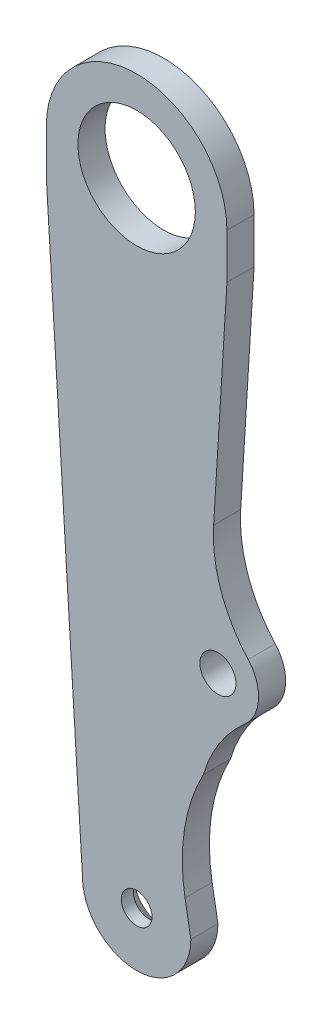
ISO-10303-21;
HEADER;
FILE_DESCRIPTION(('STEP AP214'),'2;1');
FILE_NAME('part.step','',(''),(''),'','','');
FILE_SCHEMA(('AUTOMOTIVE_DESIGN { 1 0 10303 214 1 1 1 1 }'));
ENDSEC;
DATA;
#1=APPLICATION_CONTEXT('core data for automotive mechanical design processes');
#2=APPLICATION_PROTOCOL_DEFINITION('international standard','automotive_design',2000,#1);
#3=PRODUCT_CONTEXT('',#1,'mechanical');
#4=PRODUCT('Part','Part','',(#3));
#5=PRODUCT_RELATED_PRODUCT_CATEGORY('part','',(#4));
#6=PRODUCT_DEFINITION_FORMATION('','',#4);
#7=PRODUCT_DEFINITION_CONTEXT('part definition',#1,'design');
#8=PRODUCT_DEFINITION('design','',#6,#7);
#9=PRODUCT_DEFINITION_SHAPE('','',#8);
#10=(LENGTH_UNIT() NAMED_UNIT(*) SI_UNIT(.MILLI.,.METRE.));
#11=(NAMED_UNIT(*) PLANE_ANGLE_UNIT() SI_UNIT($,.RADIAN.));
#12=(NAMED_UNIT(*) SI_UNIT($,.STERADIAN.) SOLID_ANGLE_UNIT());
#13=UNCERTAINTY_MEASURE_WITH_UNIT(LENGTH_MEASURE(1.E-05),#10,'distance_accuracy_value','');
#14=(GEOMETRIC_REPRESENTATION_CONTEXT(3) GLOBAL_UNCERTAINTY_ASSIGNED_CONTEXT((#13)) GLOBAL_UNIT_ASSIGNED_CONTEXT((#10,
#11,#12)) REPRESENTATION_CONTEXT('',''));
#15=CARTESIAN_POINT('',(0.,0.,0.));
#16=DIRECTION('',(0.,0.,1.));
#17=DIRECTION('',(1.,0.,0.));
#18=AXIS2_PLACEMENT_3D('',#15,#16,#17);
#19=CARTESIAN_POINT('',(0.,0.,0.));
#20=DIRECTION('',(0.,0.,1.));
#21=DIRECTION('',(1.,0.,0.));
#22=AXIS2_PLACEMENT_3D('',#19,#20,#21);
#23=PLANE('',#22);
#24=CARTESIAN_POINT('',(21.7837604708258,-22.7249946765542,0.));
#25=DIRECTION('',(0.,0.,1.));
#26=DIRECTION('',(1.,0.,0.));
#27=AXIS2_PLACEMENT_3D('',#24,#25,#26);
#28=CIRCLE('',#27,15.);
#29=CARTESIAN_POINT('',(11.9500985701906,-11.3980756945894,0.));
#30=VERTEX_POINT('',#29);
#31=CARTESIAN_POINT('',(7.3910741342489,-18.5,0.));
#32=VERTEX_POINT('',#31);
#33=EDGE_CURVE('E236',#30,#32,#28,.T.);
#34=ORIENTED_EDGE('',*,*,#33,.T.);
#35=CARTESIAN_POINT('',(25.0535709837935,-27.882761056311,0.));
#36=DIRECTION('',(0.,0.,1.));
#37=DIRECTION('',(1.,0.,0.));
#38=AXIS2_PLACEMENT_3D('',#35,#36,#37);
#39=CIRCLE('',#38,20.);
#40=CARTESIAN_POINT('',(5.35741592354935,-31.3557246096497,0.));
#41=VERTEX_POINT('',#40);
#42=EDGE_CURVE('E12',#32,#41,#39,.T.);
#43=ORIENTED_EDGE('',*,*,#42,.T.);
#44=DIRECTION('',(-0.173648177666935,0.984807753012207,0.));
#45=VECTOR('',#44,1.);
#46=CARTESIAN_POINT('',(-0.166274645841638,-0.0293187062696261,0.));
#47=LINE('',#46,#45);
#48=CARTESIAN_POINT('',(6.,-35.,0.));
#49=VERTEX_POINT('',#48);
#50=EDGE_CURVE('E127',#49,#41,#47,.T.);
#51=ORIENTED_EDGE('',*,*,#50,.F.);
#52=CARTESIAN_POINT('',(0.,-35.,0.));
#53=DIRECTION('',(0.,0.,-1.));
#54=DIRECTION('',(-1.,0.,0.));
#55=AXIS2_PLACEMENT_3D('',#52,#53,#54);
#56=CIRCLE('',#55,6.);
#57=CARTESIAN_POINT('',(-6.,-35.,0.));
#58=VERTEX_POINT('',#57);
#59=EDGE_CURVE('E141',#49,#58,#56,.T.);
#60=ORIENTED_EDGE('',*,*,#59,.T.);
#61=DIRECTION('',(0.06142226891833,-0.998111869922868,0.));
#62=VECTOR('',#61,1.);
#63=CARTESIAN_POINT('',(-8.12308417825983,-0.499882103277526,0.));
#64=LINE('',#63,#62);
#65=CARTESIAN_POINT('',(-9.99999999999999,30.0000000000002,0.));
#66=VERTEX_POINT('',#65);
#67=EDGE_CURVE('E135',#66,#58,#64,.T.);
#68=ORIENTED_EDGE('',*,*,#67,.F.);
#69=DIRECTION('',(0.,-1.,0.));
#70=VECTOR('',#69,1.);
#71=CARTESIAN_POINT('',(-9.99999999999999,0.,0.));
#72=LINE('',#71,#70);
#73=CARTESIAN_POINT('',(-9.99999999999999,35.,0.));
#74=VERTEX_POINT('',#73);
#75=EDGE_CURVE('E206',#74,#66,#72,.T.);
#76=ORIENTED_EDGE('',*,*,#75,.F.);
#77=CARTESIAN_POINT('',(0.,35.,0.));
#78=DIRECTION('',(0.,0.,1.));
#79=DIRECTION('',(1.,0.,0.));
#80=AXIS2_PLACEMENT_3D('',#77,#78,#79);
#81=CIRCLE('',#80,9.99999999999999);
#82=CARTESIAN_POINT('',(9.99999999999999,35.,0.));
#83=VERTEX_POINT('',#82);
#84=EDGE_CURVE('E185',#83,#74,#81,.T.);
#85=ORIENTED_EDGE('',*,*,#84,.F.);
#86=DIRECTION('',(0.,-1.,0.));
#87=VECTOR('',#86,1.);
#88=CARTESIAN_POINT('',(9.99999999999999,0.,0.));
#89=LINE('',#88,#87);
#90=CARTESIAN_POINT('',(9.99999999999999,30.0000000000002,0.));
#91=VERTEX_POINT('',#90);
#92=EDGE_CURVE('E194',#83,#91,#89,.T.);
#93=ORIENTED_EDGE('',*,*,#92,.T.);
#94=DIRECTION('',(-0.06142226891833,-0.998111869922868,0.));
#95=VECTOR('',#94,1.);
#96=CARTESIAN_POINT('',(8.12308417825983,-0.499882103277526,0.));
#97=LINE('',#96,#95);
#98=CARTESIAN_POINT('',(8.52109371572055,5.96777288045908,0.));
#99=VERTEX_POINT('',#98);
#100=EDGE_CURVE('E154',#91,#99,#97,.T.);
#101=ORIENTED_EDGE('',*,*,#100,.T.);
#102=CARTESIAN_POINT('',(23.4927717645636,5.04643884668413,0.));
#103=DIRECTION('',(0.,0.,1.));
#104=DIRECTION('',(1.,0.,0.));
#105=AXIS2_PLACEMENT_3D('',#102,#103,#104);
#106=CIRCLE('',#105,15.);
#107=CARTESIAN_POINT('',(12.3444857918224,-4.9892833430729,0.));
#108=VERTEX_POINT('',#107);
#109=EDGE_CURVE('E233',#99,#108,#106,.T.);
#110=ORIENTED_EDGE('',*,*,#109,.T.);
#111=CARTESIAN_POINT('',(8.99999999999999,-8.,0.));
#112=DIRECTION('',(0.,0.,-1.));
#113=DIRECTION('',(-1.,0.,0.));
#114=AXIS2_PLACEMENT_3D('',#111,#112,#113);
#115=CIRCLE('',#114,4.5);
#116=EDGE_CURVE('E157',#108,#30,#115,.T.);
#117=ORIENTED_EDGE('',*,*,#116,.T.);
#118=EDGE_LOOP('',(#34,#43,#51,#60,#68,#76,#85,#93,#101,#110,#117));
#119=FACE_BOUND('',#118,.T.);
#120=CARTESIAN_POINT('',(8.99999999999999,-8.,0.));
#121=DIRECTION('',(0.,0.,1.));
#122=DIRECTION('',(1.,0.,0.));
#123=AXIS2_PLACEMENT_3D('',#120,#121,#122);
#124=CIRCLE('',#123,2.);
#125=CARTESIAN_POINT('',(11.,-8.,0.));
#126=VERTEX_POINT('',#125);
#127=EDGE_CURVE('E257',#126,#126,#124,.T.);
#128=ORIENTED_EDGE('',*,*,#127,.T.);
#129=EDGE_LOOP('',(#128));
#130=FACE_BOUND('',#129,.T.);
#131=CARTESIAN_POINT('',(0.,35.,0.));
#132=DIRECTION('',(0.,0.,1.));
#133=DIRECTION('',(1.,0.,0.));
#134=AXIS2_PLACEMENT_3D('',#131,#132,#133);
#135=CIRCLE('',#134,6.5);
#136=CARTESIAN_POINT('',(6.5,35.,0.));
#137=VERTEX_POINT('',#136);
#138=EDGE_CURVE('E181',#137,#137,#135,.T.);
#139=ORIENTED_EDGE('',*,*,#138,.T.);
#140=EDGE_LOOP('',(#139));
#141=FACE_BOUND('',#140,.T.);
#142=CARTESIAN_POINT('',(0.,-35.,0.));
#143=DIRECTION('',(0.,0.,-1.));
#144=DIRECTION('',(-1.,0.,0.));
#145=AXIS2_PLACEMENT_3D('',#142,#143,#144);
#146=CIRCLE('',#145,3.36);
#147=CARTESIAN_POINT('',(-3.36,-35.,0.));
#148=VERTEX_POINT('',#147);
#149=EDGE_CURVE('E451',#148,#148,#146,.T.);
#150=ORIENTED_EDGE('',*,*,#149,.F.);
#151=EDGE_LOOP('',(#150));
#152=FACE_BOUND('',#151,.T.);
#153=ADVANCED_FACE('F42',(#119,#130,#141,#152),#23,.F.);
#154=CARTESIAN_POINT('',(0.,0.,3.));
#155=DIRECTION('',(0.,0.,1.));
#156=DIRECTION('',(1.,0.,0.));
#157=AXIS2_PLACEMENT_3D('',#154,#155,#156);
#158=PLANE('',#157);
#159=CARTESIAN_POINT('',(0.,-35.,3.));
#160=DIRECTION('',(0.,0.,-1.));
#161=DIRECTION('',(-1.,0.,0.));
#162=AXIS2_PLACEMENT_3D('',#159,#160,#161);
#163=CIRCLE('',#162,1.69999999999999);
#164=CARTESIAN_POINT('',(-1.69999999999999,-35.,3.));
#165=VERTEX_POINT('',#164);
#166=EDGE_CURVE('E456',#165,#165,#163,.T.);
#167=ORIENTED_EDGE('',*,*,#166,.T.);
#168=EDGE_LOOP('',(#167));
#169=FACE_BOUND('',#168,.T.);
#170=CARTESIAN_POINT('',(8.99999999999999,-8.,3.));
#171=DIRECTION('',(0.,0.,1.));
#172=DIRECTION('',(1.,0.,0.));
#173=AXIS2_PLACEMENT_3D('',#170,#171,#172);
#174=CIRCLE('',#173,2.);
#175=CARTESIAN_POINT('',(11.,-8.,3.));
#176=VERTEX_POINT('',#175);
#177=EDGE_CURVE('E253',#176,#176,#174,.T.);
#178=ORIENTED_EDGE('',*,*,#177,.F.);
#179=EDGE_LOOP('',(#178));
#180=FACE_BOUND('',#179,.T.);
#181=CARTESIAN_POINT('',(0.,35.,3.));
#182=DIRECTION('',(0.,0.,1.));
#183=DIRECTION('',(1.,0.,0.));
#184=AXIS2_PLACEMENT_3D('',#181,#182,#183);
#185=CIRCLE('',#184,6.5);
#186=CARTESIAN_POINT('',(6.5,35.,3.));
#187=VERTEX_POINT('',#186);
#188=EDGE_CURVE('E180',#187,#187,#185,.T.);
#189=ORIENTED_EDGE('',*,*,#188,.F.);
#190=EDGE_LOOP('',(#189));
#191=FACE_BOUND('',#190,.T.);
#192=DIRECTION('',(-0.173648177666935,0.984807753012207,0.));
#193=VECTOR('',#192,1.);
#194=CARTESIAN_POINT('',(-0.166274645841638,-0.0293187062696261,3.));
#195=LINE('',#194,#193);
#196=CARTESIAN_POINT('',(6.,-35.,3.));
#197=VERTEX_POINT('',#196);
#198=CARTESIAN_POINT('',(5.35741592354935,-31.3557246096497,3.));
#199=VERTEX_POINT('',#198);
#200=EDGE_CURVE('E129',#197,#199,#195,.T.);
#201=ORIENTED_EDGE('',*,*,#200,.T.);
#202=CARTESIAN_POINT('',(25.0535709837935,-27.882761056311,3.));
#203=DIRECTION('',(0.,0.,1.));
#204=DIRECTION('',(1.,0.,0.));
#205=AXIS2_PLACEMENT_3D('',#202,#203,#204);
#206=CIRCLE('',#205,20.);
#207=CARTESIAN_POINT('',(7.3910741342489,-18.5,3.));
#208=VERTEX_POINT('',#207);
#209=EDGE_CURVE('E51',#199,#208,#206,.F.);
#210=ORIENTED_EDGE('',*,*,#209,.T.);
#211=CARTESIAN_POINT('',(21.7837604708258,-22.7249946765542,3.));
#212=DIRECTION('',(0.,0.,1.));
#213=DIRECTION('',(1.,0.,0.));
#214=AXIS2_PLACEMENT_3D('',#211,#212,#213);
#215=CIRCLE('',#214,15.);
#216=CARTESIAN_POINT('',(11.9500985701906,-11.3980756945894,3.));
#217=VERTEX_POINT('',#216);
#218=EDGE_CURVE('E239',#208,#217,#215,.F.);
#219=ORIENTED_EDGE('',*,*,#218,.T.);
#220=CARTESIAN_POINT('',(8.99999999999999,-8.,3.));
#221=DIRECTION('',(0.,0.,1.));
#222=DIRECTION('',(1.,0.,0.));
#223=AXIS2_PLACEMENT_3D('',#220,#221,#222);
#224=CIRCLE('',#223,4.5);
#225=CARTESIAN_POINT('',(12.3444857918224,-4.9892833430729,3.));
#226=VERTEX_POINT('',#225);
#227=EDGE_CURVE('E150',#226,#217,#224,.F.);
#228=ORIENTED_EDGE('',*,*,#227,.F.);
#229=CARTESIAN_POINT('',(23.4927717645636,5.04643884668413,3.));
#230=DIRECTION('',(0.,0.,1.));
#231=DIRECTION('',(1.,0.,0.));
#232=AXIS2_PLACEMENT_3D('',#229,#230,#231);
#233=CIRCLE('',#232,15.);
#234=CARTESIAN_POINT('',(8.52109371572055,5.96777288045908,3.));
#235=VERTEX_POINT('',#234);
#236=EDGE_CURVE('E230',#226,#235,#233,.F.);
#237=ORIENTED_EDGE('',*,*,#236,.T.);
#238=DIRECTION('',(0.06142226891833,0.998111869922868,0.));
#239=VECTOR('',#238,1.);
#240=CARTESIAN_POINT('',(8.12308417825983,-0.499882103277526,3.));
#241=LINE('',#240,#239);
#242=CARTESIAN_POINT('',(9.99999999999999,30.0000000000002,3.));
#243=VERTEX_POINT('',#242);
#244=EDGE_CURVE('E166',#235,#243,#241,.T.);
#245=ORIENTED_EDGE('',*,*,#244,.T.);
#246=DIRECTION('',(0.,-1.,0.));
#247=VECTOR('',#246,1.);
#248=CARTESIAN_POINT('',(9.99999999999999,0.,3.));
#249=LINE('',#248,#247);
#250=CARTESIAN_POINT('',(9.99999999999999,35.,3.));
#251=VERTEX_POINT('',#250);
#252=EDGE_CURVE('E198',#251,#243,#249,.T.);
#253=ORIENTED_EDGE('',*,*,#252,.F.);
#254=CARTESIAN_POINT('',(0.,35.,3.));
#255=DIRECTION('',(0.,0.,1.));
#256=DIRECTION('',(1.,0.,0.));
#257=AXIS2_PLACEMENT_3D('',#254,#255,#256);
#258=CIRCLE('',#257,9.99999999999999);
#259=CARTESIAN_POINT('',(-9.99999999999999,35.,3.));
#260=VERTEX_POINT('',#259);
#261=EDGE_CURVE('E189',#251,#260,#258,.T.);
#262=ORIENTED_EDGE('',*,*,#261,.T.);
#263=DIRECTION('',(0.,-1.,0.));
#264=VECTOR('',#263,1.);
#265=CARTESIAN_POINT('',(-9.99999999999999,0.,3.));
#266=LINE('',#265,#264);
#267=CARTESIAN_POINT('',(-9.99999999999999,30.,3.));
#268=VERTEX_POINT('',#267);
#269=EDGE_CURVE('E193',#260,#268,#266,.T.);
#270=ORIENTED_EDGE('',*,*,#269,.T.);
#271=DIRECTION('',(-0.06142226891833,0.998111869922868,0.));
#272=VECTOR('',#271,1.);
#273=CARTESIAN_POINT('',(-8.12308417825983,-0.499882103277526,3.));
#274=LINE('',#273,#272);
#275=CARTESIAN_POINT('',(-6.,-35.,3.));
#276=VERTEX_POINT('',#275);
#277=EDGE_CURVE('E177',#276,#268,#274,.T.);
#278=ORIENTED_EDGE('',*,*,#277,.F.);
#279=CARTESIAN_POINT('',(0.,-35.,3.));
#280=DIRECTION('',(0.,0.,1.));
#281=DIRECTION('',(1.,0.,0.));
#282=AXIS2_PLACEMENT_3D('',#279,#280,#281);
#283=CIRCLE('',#282,6.);
#284=EDGE_CURVE('E149',#197,#276,#283,.F.);
#285=ORIENTED_EDGE('',*,*,#284,.F.);
#286=EDGE_LOOP('',(#201,#210,#219,#228,#237,#245,#253,#262,#270,#278,#285));
#287=FACE_BOUND('',#286,.T.);
#288=ADVANCED_FACE('F247',(#169,#180,#191,#287),#158,.T.);
#289=CARTESIAN_POINT('',(21.7837604708258,-22.7249946765542,15.7279220613579));
#290=DIRECTION('',(0.,0.,-1.));
#291=DIRECTION('',(-1.,0.,0.));
#292=AXIS2_PLACEMENT_3D('',#289,#290,#291);
#293=CYLINDRICAL_SURFACE('',#292,15.);
#294=DIRECTION('',(0.,0.,1.));
#295=VECTOR('',#294,1.);
#296=CARTESIAN_POINT('',(7.3910741342489,-18.5,0.));
#297=LINE('',#296,#295);
#298=EDGE_CURVE('E143',#32,#208,#297,.T.);
#299=ORIENTED_EDGE('',*,*,#298,.F.);
#300=ORIENTED_EDGE('',*,*,#33,.F.);
#301=DIRECTION('',(0.,0.,-1.));
#302=VECTOR('',#301,1.);
#303=CARTESIAN_POINT('',(11.9500985701906,-11.3980756945894,15.7279220613579));
#304=LINE('',#303,#302);
#305=EDGE_CURVE('E219',#217,#30,#304,.T.);
#306=ORIENTED_EDGE('',*,*,#305,.F.);
#307=ORIENTED_EDGE('',*,*,#218,.F.);
#308=EDGE_LOOP('',(#299,#300,#306,#307));
#309=FACE_BOUND('',#308,.T.);
#310=ADVANCED_FACE('F251',(#309),#293,.F.);
#311=CARTESIAN_POINT('',(9.99999999999999,0.,3.));
#312=DIRECTION('',(1.,0.,0.));
#313=DIRECTION('',(0.,1.,0.));
#314=AXIS2_PLACEMENT_3D('',#311,#312,#313);
#315=PLANE('',#314);
#316=ORIENTED_EDGE('',*,*,#252,.T.);
#317=DIRECTION('',(0.,0.,-1.));
#318=VECTOR('',#317,1.);
#319=CARTESIAN_POINT('',(9.99999999999999,30.0000000000002,3.5));
#320=LINE('',#319,#318);
#321=EDGE_CURVE('E136',#243,#91,#320,.T.);
#322=ORIENTED_EDGE('',*,*,#321,.T.);
#323=ORIENTED_EDGE('',*,*,#92,.F.);
#324=DIRECTION('',(0.,0.,-1.));
#325=VECTOR('',#324,1.);
#326=CARTESIAN_POINT('',(9.99999999999999,35.,3.));
#327=LINE('',#326,#325);
#328=EDGE_CURVE('E202',#251,#83,#327,.T.);
#329=ORIENTED_EDGE('',*,*,#328,.F.);
#330=EDGE_LOOP('',(#316,#322,#323,#329));
#331=FACE_BOUND('',#330,.T.);
#332=ADVANCED_FACE('F280',(#331),#315,.T.);
#333=CARTESIAN_POINT('',(0.,35.,3.));
#334=DIRECTION('',(0.,0.,-1.));
#335=DIRECTION('',(-1.,0.,0.));
#336=AXIS2_PLACEMENT_3D('',#333,#334,#335);
#337=CYLINDRICAL_SURFACE('',#336,9.99999999999999);
#338=ORIENTED_EDGE('',*,*,#84,.T.);
#339=DIRECTION('',(0.,0.,-1.));
#340=VECTOR('',#339,1.);
#341=CARTESIAN_POINT('',(-9.99999999999999,35.,3.));
#342=LINE('',#341,#340);
#343=EDGE_CURVE('E215',#260,#74,#342,.T.);
#344=ORIENTED_EDGE('',*,*,#343,.F.);
#345=ORIENTED_EDGE('',*,*,#261,.F.);
#346=ORIENTED_EDGE('',*,*,#328,.T.);
#347=EDGE_LOOP('',(#338,#344,#345,#346));
#348=FACE_BOUND('',#347,.T.);
#349=ADVANCED_FACE('F285',(#348),#337,.T.);
#350=CARTESIAN_POINT('',(-9.99999999999999,0.,3.));
#351=DIRECTION('',(1.,0.,0.));
#352=DIRECTION('',(0.,1.,0.));
#353=AXIS2_PLACEMENT_3D('',#350,#351,#352);
#354=PLANE('',#353);
#355=ORIENTED_EDGE('',*,*,#75,.T.);
#356=DIRECTION('',(0.,0.,-1.));
#357=VECTOR('',#356,1.);
#358=CARTESIAN_POINT('',(-9.99999999999999,30.,3.5));
#359=LINE('',#358,#357);
#360=EDGE_CURVE('E163',#268,#66,#359,.T.);
#361=ORIENTED_EDGE('',*,*,#360,.F.);
#362=ORIENTED_EDGE('',*,*,#269,.F.);
#363=ORIENTED_EDGE('',*,*,#343,.T.);
#364=EDGE_LOOP('',(#355,#361,#362,#363));
#365=FACE_BOUND('',#364,.T.);
#366=ADVANCED_FACE('F288',(#365),#354,.F.);
#367=CARTESIAN_POINT('',(0.,35.,0.));
#368=DIRECTION('',(0.,0.,1.));
#369=DIRECTION('',(1.,0.,0.));
#370=AXIS2_PLACEMENT_3D('',#367,#368,#369);
#371=CYLINDRICAL_SURFACE('',#370,6.5);
#372=ORIENTED_EDGE('',*,*,#138,.F.);
#373=EDGE_LOOP('',(#372));
#374=FACE_BOUND('',#373,.T.);
#375=ORIENTED_EDGE('',*,*,#188,.T.);
#376=EDGE_LOOP('',(#375));
#377=FACE_BOUND('',#376,.T.);
#378=ADVANCED_FACE('F299',(#374,#377),#371,.F.);
#379=CARTESIAN_POINT('',(8.12308417825983,-0.499882103277526,3.5));
#380=DIRECTION('',(0.998111869922868,-0.06142226891833,0.));
#381=DIRECTION('',(0.06142226891833,0.998111869922868,0.));
#382=AXIS2_PLACEMENT_3D('',#379,#380,#381);
#383=PLANE('',#382);
#384=ORIENTED_EDGE('',*,*,#244,.F.);
#385=DIRECTION('',(0.,0.,1.));
#386=VECTOR('',#385,1.);
#387=CARTESIAN_POINT('',(8.52109371572055,5.96777288045908,0.));
#388=LINE('',#387,#386);
#389=EDGE_CURVE('E227',#235,#99,#388,.F.);
#390=ORIENTED_EDGE('',*,*,#389,.T.);
#391=ORIENTED_EDGE('',*,*,#100,.F.);
#392=ORIENTED_EDGE('',*,*,#321,.F.);
#393=EDGE_LOOP('',(#384,#390,#391,#392));
#394=FACE_BOUND('',#393,.T.);
#395=ADVANCED_FACE('F277',(#394),#383,.T.);
#396=CARTESIAN_POINT('',(-8.12308417825983,-0.499882103277526,3.5));
#397=DIRECTION('',(0.998111869922868,0.06142226891833,0.));
#398=DIRECTION('',(-0.06142226891833,0.998111869922868,0.));
#399=AXIS2_PLACEMENT_3D('',#396,#397,#398);
#400=PLANE('',#399);
#401=ORIENTED_EDGE('',*,*,#277,.T.);
#402=ORIENTED_EDGE('',*,*,#360,.T.);
#403=ORIENTED_EDGE('',*,*,#67,.T.);
#404=DIRECTION('',(0.,0.,-1.));
#405=VECTOR('',#404,1.);
#406=CARTESIAN_POINT('',(-6.,-35.,3.5));
#407=LINE('',#406,#405);
#408=EDGE_CURVE('E147',#276,#58,#407,.T.);
#409=ORIENTED_EDGE('',*,*,#408,.F.);
#410=EDGE_LOOP('',(#401,#402,#403,#409));
#411=FACE_BOUND('',#410,.T.);
#412=ADVANCED_FACE('F291',(#411),#400,.F.);
#413=CARTESIAN_POINT('',(0.,-35.,19.9705627484771));
#414=DIRECTION('',(0.,0.,-1.));
#415=DIRECTION('',(-1.,0.,0.));
#416=AXIS2_PLACEMENT_3D('',#413,#414,#415);
#417=CYLINDRICAL_SURFACE('',#416,6.);
#418=ORIENTED_EDGE('',*,*,#59,.F.);
#419=DIRECTION('',(0.,0.,-1.));
#420=VECTOR('',#419,1.);
#421=CARTESIAN_POINT('',(6.,-35.,3.5));
#422=LINE('',#421,#420);
#423=EDGE_CURVE('E125',#197,#49,#422,.T.);
#424=ORIENTED_EDGE('',*,*,#423,.F.);
#425=ORIENTED_EDGE('',*,*,#284,.T.);
#426=ORIENTED_EDGE('',*,*,#408,.T.);
#427=EDGE_LOOP('',(#418,#424,#425,#426));
#428=FACE_BOUND('',#427,.T.);
#429=ADVANCED_FACE('F146',(#428),#417,.T.);
#430=CARTESIAN_POINT('',(8.99999999999999,-8.,15.7279220613579));
#431=DIRECTION('',(0.,0.,-1.));
#432=DIRECTION('',(-1.,0.,0.));
#433=AXIS2_PLACEMENT_3D('',#430,#431,#432);
#434=CYLINDRICAL_SURFACE('',#433,4.5);
#435=ORIENTED_EDGE('',*,*,#116,.F.);
#436=DIRECTION('',(0.,0.,-1.));
#437=VECTOR('',#436,1.);
#438=CARTESIAN_POINT('',(12.3444857918224,-4.98928334307289,15.7279220613579));
#439=LINE('',#438,#437);
#440=EDGE_CURVE('E223',#108,#226,#439,.F.);
#441=ORIENTED_EDGE('',*,*,#440,.T.);
#442=ORIENTED_EDGE('',*,*,#227,.T.);
#443=ORIENTED_EDGE('',*,*,#305,.T.);
#444=EDGE_LOOP('',(#435,#441,#442,#443));
#445=FACE_BOUND('',#444,.T.);
#446=ADVANCED_FACE('F269',(#445),#434,.T.);
#447=CARTESIAN_POINT('',(23.4927717645636,5.04643884668413,15.7279220613579));
#448=DIRECTION('',(0.,0.,-1.));
#449=DIRECTION('',(-1.,0.,0.));
#450=AXIS2_PLACEMENT_3D('',#447,#448,#449);
#451=CYLINDRICAL_SURFACE('',#450,15.);
#452=ORIENTED_EDGE('',*,*,#109,.F.);
#453=ORIENTED_EDGE('',*,*,#389,.F.);
#454=ORIENTED_EDGE('',*,*,#236,.F.);
#455=ORIENTED_EDGE('',*,*,#440,.F.);
#456=EDGE_LOOP('',(#452,#453,#454,#455));
#457=FACE_BOUND('',#456,.T.);
#458=ADVANCED_FACE('F271',(#457),#451,.F.);
#459=CARTESIAN_POINT('',(8.99999999999999,-8.,0.));
#460=DIRECTION('',(0.,0.,1.));
#461=DIRECTION('',(1.,0.,0.));
#462=AXIS2_PLACEMENT_3D('',#459,#460,#461);
#463=CYLINDRICAL_SURFACE('',#462,2.);
#464=ORIENTED_EDGE('',*,*,#127,.F.);
#465=EDGE_LOOP('',(#464));
#466=FACE_BOUND('',#465,.T.);
#467=ORIENTED_EDGE('',*,*,#177,.T.);
#468=EDGE_LOOP('',(#467));
#469=FACE_BOUND('',#468,.T.);
#470=ADVANCED_FACE('F317',(#466,#469),#463,.F.);
#471=CARTESIAN_POINT('',(-0.166274645841638,-0.0293187062696261,0.));
#472=DIRECTION('',(0.984807753012207,0.173648177666935,0.));
#473=DIRECTION('',(-0.173648177666935,0.984807753012207,0.));
#474=AXIS2_PLACEMENT_3D('',#471,#472,#473);
#475=PLANE('',#474);
#476=ORIENTED_EDGE('',*,*,#50,.T.);
#477=DIRECTION('',(0.,0.,1.));
#478=VECTOR('',#477,1.);
#479=CARTESIAN_POINT('',(5.35741592354935,-31.3557246096497,3.));
#480=LINE('',#479,#478);
#481=EDGE_CURVE('E242',#41,#199,#480,.T.);
#482=ORIENTED_EDGE('',*,*,#481,.T.);
#483=ORIENTED_EDGE('',*,*,#200,.F.);
#484=ORIENTED_EDGE('',*,*,#423,.T.);
#485=EDGE_LOOP('',(#476,#482,#483,#484));
#486=FACE_BOUND('',#485,.T.);
#487=ADVANCED_FACE('F126',(#486),#475,.T.);
#488=CARTESIAN_POINT('',(25.0535709837935,-27.882761056311,15.7279220613579));
#489=DIRECTION('',(0.,0.,-1.));
#490=DIRECTION('',(-1.,0.,0.));
#491=AXIS2_PLACEMENT_3D('',#488,#489,#490);
#492=CYLINDRICAL_SURFACE('',#491,20.);
#493=ORIENTED_EDGE('',*,*,#42,.F.);
#494=ORIENTED_EDGE('',*,*,#298,.T.);
#495=ORIENTED_EDGE('',*,*,#209,.F.);
#496=ORIENTED_EDGE('',*,*,#481,.F.);
#497=EDGE_LOOP('',(#493,#494,#495,#496));
#498=FACE_BOUND('',#497,.T.);
#499=ADVANCED_FACE('F44',(#498),#492,.F.);
#500=CARTESIAN_POINT('',(0.,-35.,0.));
#501=DIRECTION('',(0.,0.,-1.));
#502=DIRECTION('',(-1.,0.,0.));
#503=AXIS2_PLACEMENT_3D('',#500,#501,#502);
#504=CYLINDRICAL_SURFACE('',#503,1.69999999999999);
#505=ORIENTED_EDGE('',*,*,#166,.F.);
#506=EDGE_LOOP('',(#505));
#507=FACE_BOUND('',#506,.T.);
#508=CARTESIAN_POINT('',(0.,-35.,1.66000000000002));
#509=DIRECTION('',(0.,0.,-1.));
#510=DIRECTION('',(-1.,0.,0.));
#511=AXIS2_PLACEMENT_3D('',#508,#509,#510);
#512=CIRCLE('',#511,1.69999999999999);
#513=CARTESIAN_POINT('',(-1.69999999999999,-35.,1.66000000000002));
#514=VERTEX_POINT('',#513);
#515=EDGE_CURVE('E448',#514,#514,#512,.T.);
#516=ORIENTED_EDGE('',*,*,#515,.T.);
#517=EDGE_LOOP('',(#516));
#518=FACE_BOUND('',#517,.T.);
#519=ADVANCED_FACE('F392',(#507,#518),#504,.F.);
#520=CARTESIAN_POINT('',(0.,-35.,0.));
#521=DIRECTION('',(0.,0.,-1.));
#522=DIRECTION('',(-1.,0.,0.));
#523=AXIS2_PLACEMENT_3D('',#520,#521,#522);
#524=CONICAL_SURFACE('',#523,3.36,0.785398163397445);
#525=ORIENTED_EDGE('',*,*,#515,.F.);
#526=EDGE_LOOP('',(#525));
#527=FACE_BOUND('',#526,.T.);
#528=ORIENTED_EDGE('',*,*,#149,.T.);
#529=EDGE_LOOP('',(#528));
#530=FACE_BOUND('',#529,.T.);
#531=ADVANCED_FACE('F398',(#527,#530),#524,.F.);
#532=CLOSED_SHELL('',(#153,#288,#310,#332,#349,#366,#378,#395,#412,#429,#446,#458,#470,#487,
#499,#519,#531));
#533=MANIFOLD_SOLID_BREP('B2',#532);
#534=ADVANCED_BREP_SHAPE_REPRESENTATION('',(#18,#533),#14);
#535=SHAPE_DEFINITION_REPRESENTATION(#9,#534);
ENDSEC;
END-ISO-10303-21;
